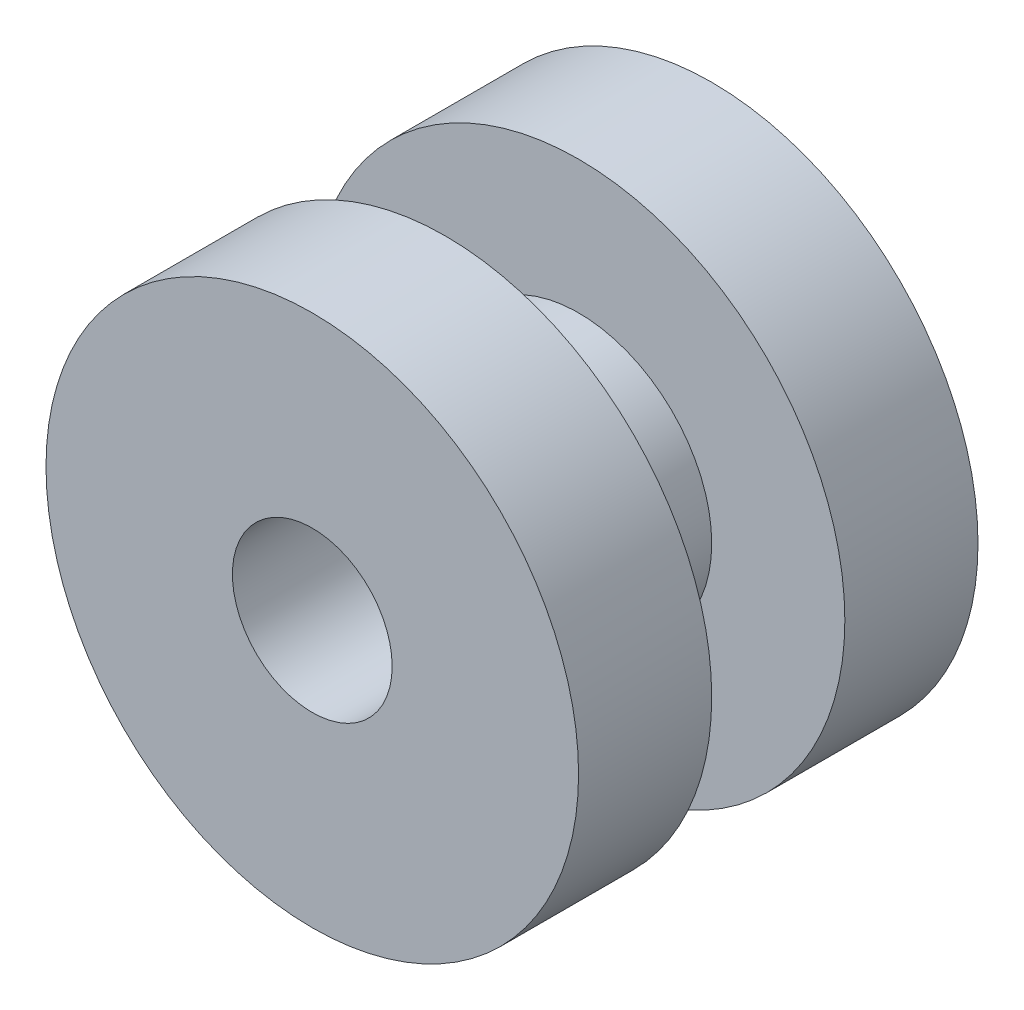
ISO-10303-21;
HEADER;
FILE_DESCRIPTION(('STEP AP214'),'2;1');
FILE_NAME('part.step','',(''),(''),'','','');
FILE_SCHEMA(('AUTOMOTIVE_DESIGN { 1 0 10303 214 1 1 1 1 }'));
ENDSEC;
DATA;
#1=APPLICATION_CONTEXT('core data for automotive mechanical design processes');
#2=APPLICATION_PROTOCOL_DEFINITION('international standard','automotive_design',2000,#1);
#3=PRODUCT_CONTEXT('',#1,'mechanical');
#4=PRODUCT('Part','Part','',(#3));
#5=PRODUCT_RELATED_PRODUCT_CATEGORY('part','',(#4));
#6=PRODUCT_DEFINITION_FORMATION('','',#4);
#7=PRODUCT_DEFINITION_CONTEXT('part definition',#1,'design');
#8=PRODUCT_DEFINITION('design','',#6,#7);
#9=PRODUCT_DEFINITION_SHAPE('','',#8);
#10=(LENGTH_UNIT() NAMED_UNIT(*) SI_UNIT(.MILLI.,.METRE.));
#11=(NAMED_UNIT(*) PLANE_ANGLE_UNIT() SI_UNIT($,.RADIAN.));
#12=(NAMED_UNIT(*) SI_UNIT($,.STERADIAN.) SOLID_ANGLE_UNIT());
#13=UNCERTAINTY_MEASURE_WITH_UNIT(LENGTH_MEASURE(1.E-05),#10,'distance_accuracy_value','');
#14=(GEOMETRIC_REPRESENTATION_CONTEXT(3) GLOBAL_UNCERTAINTY_ASSIGNED_CONTEXT((#13)) GLOBAL_UNIT_ASSIGNED_CONTEXT((#10,
#11,#12)) REPRESENTATION_CONTEXT('',''));
#15=CARTESIAN_POINT('',(0.,0.,0.));
#16=DIRECTION('',(0.,0.,1.));
#17=DIRECTION('',(1.,0.,0.));
#18=AXIS2_PLACEMENT_3D('',#15,#16,#17);
#19=CARTESIAN_POINT('',(0.,0.,5.));
#20=DIRECTION('',(0.,0.,-1.));
#21=DIRECTION('',(-1.,0.,0.));
#22=AXIS2_PLACEMENT_3D('',#19,#20,#21);
#23=CYLINDRICAL_SURFACE('',#22,10.);
#24=CARTESIAN_POINT('',(0.,0.,5.));
#25=DIRECTION('',(0.,0.,1.));
#26=DIRECTION('',(1.,0.,0.));
#27=AXIS2_PLACEMENT_3D('',#24,#25,#26);
#28=CIRCLE('',#27,10.);
#29=CARTESIAN_POINT('',(10.,0.,5.));
#30=VERTEX_POINT('',#29);
#31=EDGE_CURVE('E45',#30,#30,#28,.T.);
#32=ORIENTED_EDGE('',*,*,#31,.F.);
#33=EDGE_LOOP('',(#32));
#34=FACE_BOUND('',#33,.T.);
#35=CARTESIAN_POINT('',(0.,0.,0.));
#36=DIRECTION('',(0.,0.,1.));
#37=DIRECTION('',(1.,0.,0.));
#38=AXIS2_PLACEMENT_3D('',#35,#36,#37);
#39=CIRCLE('',#38,10.);
#40=CARTESIAN_POINT('',(10.,0.,0.));
#41=VERTEX_POINT('',#40);
#42=EDGE_CURVE('E40',#41,#41,#39,.T.);
#43=ORIENTED_EDGE('',*,*,#42,.T.);
#44=EDGE_LOOP('',(#43));
#45=FACE_BOUND('',#44,.T.);
#46=ADVANCED_FACE('F37',(#34,#45),#23,.T.);
#47=CARTESIAN_POINT('',(0.,0.,5.));
#48=DIRECTION('',(0.,0.,1.));
#49=DIRECTION('',(1.,0.,0.));
#50=AXIS2_PLACEMENT_3D('',#47,#48,#49);
#51=PLANE('',#50);
#52=CARTESIAN_POINT('',(0.,0.,5.));
#53=DIRECTION('',(0.,0.,1.));
#54=DIRECTION('',(1.,0.,0.));
#55=AXIS2_PLACEMENT_3D('',#52,#53,#54);
#56=CIRCLE('',#55,5.);
#57=CARTESIAN_POINT('',(5.,0.,5.));
#58=VERTEX_POINT('',#57);
#59=EDGE_CURVE('E10',#58,#58,#56,.T.);
#60=ORIENTED_EDGE('',*,*,#59,.F.);
#61=EDGE_LOOP('',(#60));
#62=FACE_BOUND('',#61,.T.);
#63=ORIENTED_EDGE('',*,*,#31,.T.);
#64=EDGE_LOOP('',(#63));
#65=FACE_BOUND('',#64,.T.);
#66=ADVANCED_FACE('F102',(#62,#65),#51,.T.);
#67=CARTESIAN_POINT('',(0.,0.,0.));
#68=DIRECTION('',(0.,0.,1.));
#69=DIRECTION('',(1.,0.,0.));
#70=AXIS2_PLACEMENT_3D('',#67,#68,#69);
#71=PLANE('',#70);
#72=CARTESIAN_POINT('',(0.,0.,0.));
#73=DIRECTION('',(0.,0.,1.));
#74=DIRECTION('',(1.,0.,0.));
#75=AXIS2_PLACEMENT_3D('',#72,#73,#74);
#76=CIRCLE('',#75,3.);
#77=CARTESIAN_POINT('',(3.,0.,0.));
#78=VERTEX_POINT('',#77);
#79=EDGE_CURVE('E61',#78,#78,#76,.T.);
#80=ORIENTED_EDGE('',*,*,#79,.T.);
#81=EDGE_LOOP('',(#80));
#82=FACE_BOUND('',#81,.T.);
#83=ORIENTED_EDGE('',*,*,#42,.F.);
#84=EDGE_LOOP('',(#83));
#85=FACE_BOUND('',#84,.T.);
#86=ADVANCED_FACE('F73',(#82,#85),#71,.F.);
#87=CARTESIAN_POINT('',(0.,0.,10.));
#88=DIRECTION('',(0.,0.,-1.));
#89=DIRECTION('',(-1.,0.,0.));
#90=AXIS2_PLACEMENT_3D('',#87,#88,#89);
#91=CYLINDRICAL_SURFACE('',#90,5.);
#92=CARTESIAN_POINT('',(0.,0.,10.));
#93=DIRECTION('',(0.,0.,1.));
#94=DIRECTION('',(1.,0.,0.));
#95=AXIS2_PLACEMENT_3D('',#92,#93,#94);
#96=CIRCLE('',#95,5.);
#97=CARTESIAN_POINT('',(5.,0.,10.));
#98=VERTEX_POINT('',#97);
#99=EDGE_CURVE('E52',#98,#98,#96,.T.);
#100=ORIENTED_EDGE('',*,*,#99,.F.);
#101=EDGE_LOOP('',(#100));
#102=FACE_BOUND('',#101,.T.);
#103=ORIENTED_EDGE('',*,*,#59,.T.);
#104=EDGE_LOOP('',(#103));
#105=FACE_BOUND('',#104,.T.);
#106=ADVANCED_FACE('F92',(#102,#105),#91,.T.);
#107=CARTESIAN_POINT('',(0.,0.,15.));
#108=DIRECTION('',(0.,0.,-1.));
#109=DIRECTION('',(-1.,0.,0.));
#110=AXIS2_PLACEMENT_3D('',#107,#108,#109);
#111=CYLINDRICAL_SURFACE('',#110,10.);
#112=CARTESIAN_POINT('',(0.,0.,15.));
#113=DIRECTION('',(0.,0.,1.));
#114=DIRECTION('',(1.,0.,0.));
#115=AXIS2_PLACEMENT_3D('',#112,#113,#114);
#116=CIRCLE('',#115,10.);
#117=CARTESIAN_POINT('',(10.,0.,15.));
#118=VERTEX_POINT('',#117);
#119=EDGE_CURVE('E56',#118,#118,#116,.T.);
#120=ORIENTED_EDGE('',*,*,#119,.F.);
#121=EDGE_LOOP('',(#120));
#122=FACE_BOUND('',#121,.T.);
#123=CARTESIAN_POINT('',(0.,0.,10.));
#124=DIRECTION('',(0.,0.,1.));
#125=DIRECTION('',(1.,0.,0.));
#126=AXIS2_PLACEMENT_3D('',#123,#124,#125);
#127=CIRCLE('',#126,10.);
#128=CARTESIAN_POINT('',(10.,0.,10.));
#129=VERTEX_POINT('',#128);
#130=EDGE_CURVE('E57',#129,#129,#127,.T.);
#131=ORIENTED_EDGE('',*,*,#130,.T.);
#132=EDGE_LOOP('',(#131));
#133=FACE_BOUND('',#132,.T.);
#134=ADVANCED_FACE('F86',(#122,#133),#111,.T.);
#135=CARTESIAN_POINT('',(0.,0.,15.));
#136=DIRECTION('',(0.,0.,1.));
#137=DIRECTION('',(1.,0.,0.));
#138=AXIS2_PLACEMENT_3D('',#135,#136,#137);
#139=PLANE('',#138);
#140=CARTESIAN_POINT('',(0.,0.,15.));
#141=DIRECTION('',(0.,0.,1.));
#142=DIRECTION('',(1.,0.,0.));
#143=AXIS2_PLACEMENT_3D('',#140,#141,#142);
#144=CIRCLE('',#143,3.);
#145=CARTESIAN_POINT('',(3.,0.,15.));
#146=VERTEX_POINT('',#145);
#147=EDGE_CURVE('E65',#146,#146,#144,.T.);
#148=ORIENTED_EDGE('',*,*,#147,.F.);
#149=EDGE_LOOP('',(#148));
#150=FACE_BOUND('',#149,.T.);
#151=ORIENTED_EDGE('',*,*,#119,.T.);
#152=EDGE_LOOP('',(#151));
#153=FACE_BOUND('',#152,.T.);
#154=ADVANCED_FACE('F83',(#150,#153),#139,.T.);
#155=CARTESIAN_POINT('',(0.,0.,10.));
#156=DIRECTION('',(0.,0.,1.));
#157=DIRECTION('',(1.,0.,0.));
#158=AXIS2_PLACEMENT_3D('',#155,#156,#157);
#159=PLANE('',#158);
#160=ORIENTED_EDGE('',*,*,#99,.T.);
#161=EDGE_LOOP('',(#160));
#162=FACE_BOUND('',#161,.T.);
#163=ORIENTED_EDGE('',*,*,#130,.F.);
#164=EDGE_LOOP('',(#163));
#165=FACE_BOUND('',#164,.T.);
#166=ADVANCED_FACE('F79',(#162,#165),#159,.F.);
#167=CARTESIAN_POINT('',(0.,0.,0.));
#168=DIRECTION('',(0.,0.,1.));
#169=DIRECTION('',(1.,0.,0.));
#170=AXIS2_PLACEMENT_3D('',#167,#168,#169);
#171=CYLINDRICAL_SURFACE('',#170,3.);
#172=ORIENTED_EDGE('',*,*,#79,.F.);
#173=EDGE_LOOP('',(#172));
#174=FACE_BOUND('',#173,.T.);
#175=ORIENTED_EDGE('',*,*,#147,.T.);
#176=EDGE_LOOP('',(#175));
#177=FACE_BOUND('',#176,.T.);
#178=ADVANCED_FACE('F76',(#174,#177),#171,.F.);
#179=CLOSED_SHELL('',(#46,#66,#86,#106,#134,#154,#166,#178));
#180=MANIFOLD_SOLID_BREP('B2',#179);
#181=ADVANCED_BREP_SHAPE_REPRESENTATION('',(#18,#180),#14);
#182=SHAPE_DEFINITION_REPRESENTATION(#9,#181);
ENDSEC;
END-ISO-10303-21;
